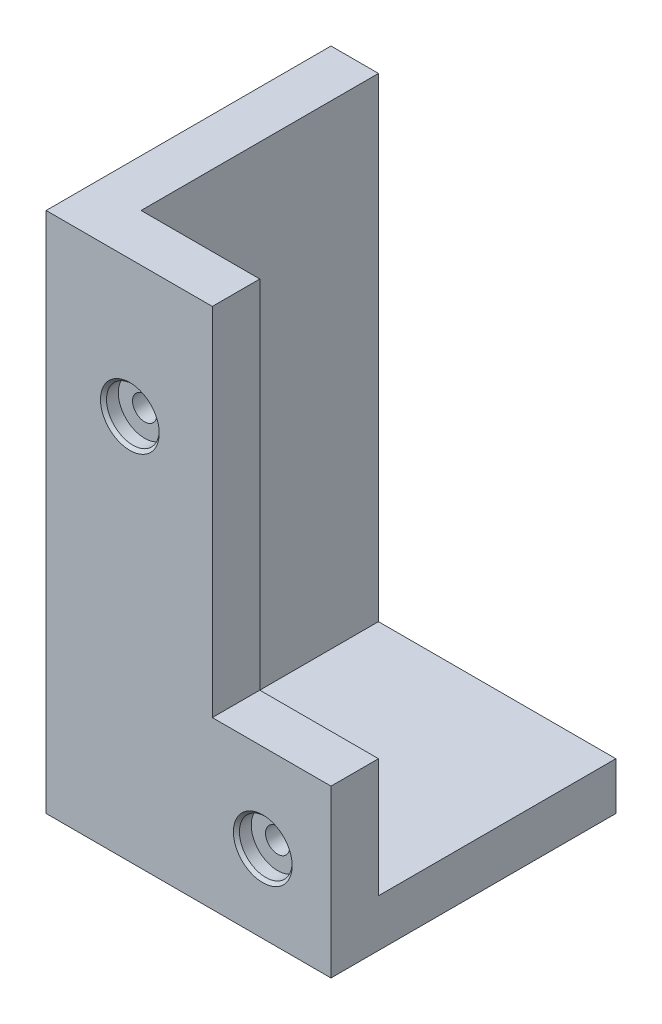
ISO-10303-21;
HEADER;
FILE_DESCRIPTION(('STEP AP214'),'2;1');
FILE_NAME('part.step','',(''),(''),'','','');
FILE_SCHEMA(('AUTOMOTIVE_DESIGN { 1 0 10303 214 1 1 1 1 }'));
ENDSEC;
DATA;
#1=APPLICATION_CONTEXT('core data for automotive mechanical design processes');
#2=APPLICATION_PROTOCOL_DEFINITION('international standard','automotive_design',2000,#1);
#3=PRODUCT_CONTEXT('',#1,'mechanical');
#4=PRODUCT('Part','Part','',(#3));
#5=PRODUCT_RELATED_PRODUCT_CATEGORY('part','',(#4));
#6=PRODUCT_DEFINITION_FORMATION('','',#4);
#7=PRODUCT_DEFINITION_CONTEXT('part definition',#1,'design');
#8=PRODUCT_DEFINITION('design','',#6,#7);
#9=PRODUCT_DEFINITION_SHAPE('','',#8);
#10=(LENGTH_UNIT() NAMED_UNIT(*) SI_UNIT(.MILLI.,.METRE.));
#11=(NAMED_UNIT(*) PLANE_ANGLE_UNIT() SI_UNIT($,.RADIAN.));
#12=(NAMED_UNIT(*) SI_UNIT($,.STERADIAN.) SOLID_ANGLE_UNIT());
#13=UNCERTAINTY_MEASURE_WITH_UNIT(LENGTH_MEASURE(1.E-05),#10,'distance_accuracy_value','');
#14=(GEOMETRIC_REPRESENTATION_CONTEXT(3) GLOBAL_UNCERTAINTY_ASSIGNED_CONTEXT((#13)) GLOBAL_UNIT_ASSIGNED_CONTEXT((#10,
#11,#12)) REPRESENTATION_CONTEXT('',''));
#15=CARTESIAN_POINT('',(0.,0.,0.));
#16=DIRECTION('',(0.,0.,1.));
#17=DIRECTION('',(1.,0.,0.));
#18=AXIS2_PLACEMENT_3D('',#15,#16,#17);
#19=CARTESIAN_POINT('',(0.,0.,50.));
#20=DIRECTION('',(1.,0.,0.));
#21=DIRECTION('',(0.,0.,-1.));
#22=AXIS2_PLACEMENT_3D('',#19,#20,#21);
#23=PLANE('',#22);
#24=DIRECTION('',(0.,-1.,0.));
#25=VECTOR('',#24,1.);
#26=CARTESIAN_POINT('',(0.,0.,0.));
#27=LINE('',#26,#25);
#28=CARTESIAN_POINT('',(0.,110.,0.));
#29=VERTEX_POINT('',#28);
#30=CARTESIAN_POINT('',(0.,0.,0.));
#31=VERTEX_POINT('',#30);
#32=EDGE_CURVE('E96',#29,#31,#27,.T.);
#33=ORIENTED_EDGE('',*,*,#32,.T.);
#34=DIRECTION('',(0.,0.,-1.));
#35=VECTOR('',#34,1.);
#36=CARTESIAN_POINT('',(0.,0.,50.));
#37=LINE('',#36,#35);
#38=CARTESIAN_POINT('',(0.,0.,60.));
#39=VERTEX_POINT('',#38);
#40=EDGE_CURVE('E11',#39,#31,#37,.T.);
#41=ORIENTED_EDGE('',*,*,#40,.F.);
#42=DIRECTION('',(0.,-1.,0.));
#43=VECTOR('',#42,1.);
#44=CARTESIAN_POINT('',(0.,0.,60.));
#45=LINE('',#44,#43);
#46=CARTESIAN_POINT('',(0.,110.,60.));
#47=VERTEX_POINT('',#46);
#48=EDGE_CURVE('E98',#47,#39,#45,.T.);
#49=ORIENTED_EDGE('',*,*,#48,.F.);
#50=DIRECTION('',(0.,0.,-1.));
#51=VECTOR('',#50,1.);
#52=CARTESIAN_POINT('',(0.,110.,50.));
#53=LINE('',#52,#51);
#54=EDGE_CURVE('E84',#47,#29,#53,.T.);
#55=ORIENTED_EDGE('',*,*,#54,.T.);
#56=EDGE_LOOP('',(#33,#41,#49,#55));
#57=FACE_BOUND('',#56,.T.);
#58=ADVANCED_FACE('F33',(#57),#23,.F.);
#59=CARTESIAN_POINT('',(0.,0.,50.));
#60=DIRECTION('',(0.,1.,0.));
#61=DIRECTION('',(0.,0.,1.));
#62=AXIS2_PLACEMENT_3D('',#59,#60,#61);
#63=PLANE('',#62);
#64=DIRECTION('',(1.,0.,0.));
#65=VECTOR('',#64,1.);
#66=CARTESIAN_POINT('',(0.,0.,0.));
#67=LINE('',#66,#65);
#68=CARTESIAN_POINT('',(60.,0.,0.));
#69=VERTEX_POINT('',#68);
#70=EDGE_CURVE('E103',#31,#69,#67,.T.);
#71=ORIENTED_EDGE('',*,*,#70,.T.);
#72=DIRECTION('',(0.,0.,-1.));
#73=VECTOR('',#72,1.);
#74=CARTESIAN_POINT('',(60.,0.,50.));
#75=LINE('',#74,#73);
#76=CARTESIAN_POINT('',(60.,0.,60.));
#77=VERTEX_POINT('',#76);
#78=EDGE_CURVE('E42',#77,#69,#75,.T.);
#79=ORIENTED_EDGE('',*,*,#78,.F.);
#80=DIRECTION('',(1.,0.,0.));
#81=VECTOR('',#80,1.);
#82=CARTESIAN_POINT('',(60.,0.,60.));
#83=LINE('',#82,#81);
#84=EDGE_CURVE('E154',#39,#77,#83,.T.);
#85=ORIENTED_EDGE('',*,*,#84,.F.);
#86=ORIENTED_EDGE('',*,*,#40,.T.);
#87=EDGE_LOOP('',(#71,#79,#85,#86));
#88=FACE_BOUND('',#87,.T.);
#89=ADVANCED_FACE('F224',(#88),#63,.F.);
#90=CARTESIAN_POINT('',(60.,10.,50.));
#91=DIRECTION('',(-1.,0.,0.));
#92=DIRECTION('',(0.,0.,1.));
#93=AXIS2_PLACEMENT_3D('',#90,#91,#92);
#94=PLANE('',#93);
#95=DIRECTION('',(0.,1.,0.));
#96=VECTOR('',#95,1.);
#97=CARTESIAN_POINT('',(60.,10.,0.));
#98=LINE('',#97,#96);
#99=CARTESIAN_POINT('',(60.,10.,0.));
#100=VERTEX_POINT('',#99);
#101=EDGE_CURVE('E106',#69,#100,#98,.T.);
#102=ORIENTED_EDGE('',*,*,#101,.T.);
#103=DIRECTION('',(0.,0.,-1.));
#104=VECTOR('',#103,1.);
#105=CARTESIAN_POINT('',(60.,10.,50.));
#106=LINE('',#105,#104);
#107=CARTESIAN_POINT('',(60.,10.,50.));
#108=VERTEX_POINT('',#107);
#109=EDGE_CURVE('E120',#108,#100,#106,.T.);
#110=ORIENTED_EDGE('',*,*,#109,.F.);
#111=DIRECTION('',(0.,1.,0.));
#112=VECTOR('',#111,1.);
#113=CARTESIAN_POINT('',(60.,35.,50.));
#114=LINE('',#113,#112);
#115=CARTESIAN_POINT('',(60.,35.,50.));
#116=VERTEX_POINT('',#115);
#117=EDGE_CURVE('E137',#108,#116,#114,.T.);
#118=ORIENTED_EDGE('',*,*,#117,.T.);
#119=DIRECTION('',(0.,0.,-1.));
#120=VECTOR('',#119,1.);
#121=CARTESIAN_POINT('',(60.,35.,60.));
#122=LINE('',#121,#120);
#123=CARTESIAN_POINT('',(60.,35.,60.));
#124=VERTEX_POINT('',#123);
#125=EDGE_CURVE('E104',#124,#116,#122,.T.);
#126=ORIENTED_EDGE('',*,*,#125,.F.);
#127=DIRECTION('',(0.,1.,0.));
#128=VECTOR('',#127,1.);
#129=CARTESIAN_POINT('',(60.,35.,60.));
#130=LINE('',#129,#128);
#131=EDGE_CURVE('E158',#77,#124,#130,.T.);
#132=ORIENTED_EDGE('',*,*,#131,.F.);
#133=ORIENTED_EDGE('',*,*,#78,.T.);
#134=EDGE_LOOP('',(#102,#110,#118,#126,#132,#133));
#135=FACE_BOUND('',#134,.T.);
#136=ADVANCED_FACE('F207',(#135),#94,.F.);
#137=CARTESIAN_POINT('',(10.,10.,50.));
#138=DIRECTION('',(0.,-1.,0.));
#139=DIRECTION('',(0.,0.,-1.));
#140=AXIS2_PLACEMENT_3D('',#137,#138,#139);
#141=PLANE('',#140);
#142=DIRECTION('',(-1.,0.,0.));
#143=VECTOR('',#142,1.);
#144=CARTESIAN_POINT('',(10.,10.,0.));
#145=LINE('',#144,#143);
#146=CARTESIAN_POINT('',(10.,10.,0.));
#147=VERTEX_POINT('',#146);
#148=EDGE_CURVE('E116',#100,#147,#145,.T.);
#149=ORIENTED_EDGE('',*,*,#148,.T.);
#150=DIRECTION('',(0.,0.,-1.));
#151=VECTOR('',#150,1.);
#152=CARTESIAN_POINT('',(10.,10.,50.));
#153=LINE('',#152,#151);
#154=CARTESIAN_POINT('',(10.,10.,50.));
#155=VERTEX_POINT('',#154);
#156=EDGE_CURVE('E51',#155,#147,#153,.T.);
#157=ORIENTED_EDGE('',*,*,#156,.F.);
#158=DIRECTION('',(-1.,0.,0.));
#159=VECTOR('',#158,1.);
#160=CARTESIAN_POINT('',(10.,10.,50.));
#161=LINE('',#160,#159);
#162=EDGE_CURVE('E90',#108,#155,#161,.T.);
#163=ORIENTED_EDGE('',*,*,#162,.F.);
#164=ORIENTED_EDGE('',*,*,#109,.T.);
#165=EDGE_LOOP('',(#149,#157,#163,#164));
#166=FACE_BOUND('',#165,.T.);
#167=ADVANCED_FACE('F226',(#166),#141,.F.);
#168=CARTESIAN_POINT('',(10.,110.,50.));
#169=DIRECTION('',(-1.,0.,0.));
#170=DIRECTION('',(0.,0.,1.));
#171=AXIS2_PLACEMENT_3D('',#168,#169,#170);
#172=PLANE('',#171);
#173=DIRECTION('',(0.,1.,0.));
#174=VECTOR('',#173,1.);
#175=CARTESIAN_POINT('',(10.,110.,0.));
#176=LINE('',#175,#174);
#177=CARTESIAN_POINT('',(10.,110.,0.));
#178=VERTEX_POINT('',#177);
#179=EDGE_CURVE('E73',#147,#178,#176,.T.);
#180=ORIENTED_EDGE('',*,*,#179,.T.);
#181=DIRECTION('',(0.,0.,-1.));
#182=VECTOR('',#181,1.);
#183=CARTESIAN_POINT('',(10.,110.,50.));
#184=LINE('',#183,#182);
#185=CARTESIAN_POINT('',(10.,110.,50.));
#186=VERTEX_POINT('',#185);
#187=EDGE_CURVE('E87',#186,#178,#184,.T.);
#188=ORIENTED_EDGE('',*,*,#187,.F.);
#189=DIRECTION('',(0.,1.,0.));
#190=VECTOR('',#189,1.);
#191=CARTESIAN_POINT('',(10.,110.,50.));
#192=LINE('',#191,#190);
#193=EDGE_CURVE('E99',#155,#186,#192,.T.);
#194=ORIENTED_EDGE('',*,*,#193,.F.);
#195=ORIENTED_EDGE('',*,*,#156,.T.);
#196=EDGE_LOOP('',(#180,#188,#194,#195));
#197=FACE_BOUND('',#196,.T.);
#198=ADVANCED_FACE('F220',(#197),#172,.F.);
#199=CARTESIAN_POINT('',(0.,110.,50.));
#200=DIRECTION('',(0.,-1.,0.));
#201=DIRECTION('',(1.,0.,0.));
#202=AXIS2_PLACEMENT_3D('',#199,#200,#201);
#203=PLANE('',#202);
#204=DIRECTION('',(-1.,0.,0.));
#205=VECTOR('',#204,1.);
#206=CARTESIAN_POINT('',(0.,110.,0.));
#207=LINE('',#206,#205);
#208=EDGE_CURVE('E79',#178,#29,#207,.T.);
#209=ORIENTED_EDGE('',*,*,#208,.T.);
#210=ORIENTED_EDGE('',*,*,#54,.F.);
#211=DIRECTION('',(-1.,0.,0.));
#212=VECTOR('',#211,1.);
#213=CARTESIAN_POINT('',(0.,110.,60.));
#214=LINE('',#213,#212);
#215=CARTESIAN_POINT('',(35.,110.,60.));
#216=VERTEX_POINT('',#215);
#217=EDGE_CURVE('E167',#216,#47,#214,.T.);
#218=ORIENTED_EDGE('',*,*,#217,.F.);
#219=DIRECTION('',(0.,0.,-1.));
#220=VECTOR('',#219,1.);
#221=CARTESIAN_POINT('',(35.,110.,60.));
#222=LINE('',#221,#220);
#223=CARTESIAN_POINT('',(35.,110.,50.));
#224=VERTEX_POINT('',#223);
#225=EDGE_CURVE('E169',#216,#224,#222,.T.);
#226=ORIENTED_EDGE('',*,*,#225,.T.);
#227=DIRECTION('',(-1.,0.,0.));
#228=VECTOR('',#227,1.);
#229=CARTESIAN_POINT('',(0.,110.,50.));
#230=LINE('',#229,#228);
#231=EDGE_CURVE('E155',#224,#186,#230,.T.);
#232=ORIENTED_EDGE('',*,*,#231,.T.);
#233=ORIENTED_EDGE('',*,*,#187,.T.);
#234=EDGE_LOOP('',(#209,#210,#218,#226,#232,#233));
#235=FACE_BOUND('',#234,.T.);
#236=ADVANCED_FACE('F81',(#235),#203,.F.);
#237=CARTESIAN_POINT('',(0.,0.,0.));
#238=DIRECTION('',(0.,0.,-1.));
#239=DIRECTION('',(-1.,0.,0.));
#240=AXIS2_PLACEMENT_3D('',#237,#238,#239);
#241=PLANE('',#240);
#242=ORIENTED_EDGE('',*,*,#32,.F.);
#243=ORIENTED_EDGE('',*,*,#208,.F.);
#244=ORIENTED_EDGE('',*,*,#179,.F.);
#245=ORIENTED_EDGE('',*,*,#148,.F.);
#246=ORIENTED_EDGE('',*,*,#101,.F.);
#247=ORIENTED_EDGE('',*,*,#70,.F.);
#248=EDGE_LOOP('',(#242,#243,#244,#245,#246,#247));
#249=FACE_BOUND('',#248,.T.);
#250=ADVANCED_FACE('F101',(#249),#241,.T.);
#251=CARTESIAN_POINT('',(35.,35.,60.));
#252=DIRECTION('',(0.,-1.,0.));
#253=DIRECTION('',(0.,0.,-1.));
#254=AXIS2_PLACEMENT_3D('',#251,#252,#253);
#255=PLANE('',#254);
#256=DIRECTION('',(-1.,0.,0.));
#257=VECTOR('',#256,1.);
#258=CARTESIAN_POINT('',(35.,35.,50.));
#259=LINE('',#258,#257);
#260=CARTESIAN_POINT('',(35.,35.,50.));
#261=VERTEX_POINT('',#260);
#262=EDGE_CURVE('E142',#116,#261,#259,.T.);
#263=ORIENTED_EDGE('',*,*,#262,.T.);
#264=DIRECTION('',(0.,0.,-1.));
#265=VECTOR('',#264,1.);
#266=CARTESIAN_POINT('',(35.,35.,60.));
#267=LINE('',#266,#265);
#268=CARTESIAN_POINT('',(35.,35.,60.));
#269=VERTEX_POINT('',#268);
#270=EDGE_CURVE('E109',#269,#261,#267,.T.);
#271=ORIENTED_EDGE('',*,*,#270,.F.);
#272=DIRECTION('',(-1.,0.,0.));
#273=VECTOR('',#272,1.);
#274=CARTESIAN_POINT('',(35.,35.,60.));
#275=LINE('',#274,#273);
#276=EDGE_CURVE('E161',#124,#269,#275,.T.);
#277=ORIENTED_EDGE('',*,*,#276,.F.);
#278=ORIENTED_EDGE('',*,*,#125,.T.);
#279=EDGE_LOOP('',(#263,#271,#277,#278));
#280=FACE_BOUND('',#279,.T.);
#281=ADVANCED_FACE('F201',(#280),#255,.F.);
#282=CARTESIAN_POINT('',(35.,110.,60.));
#283=DIRECTION('',(-1.,0.,0.));
#284=DIRECTION('',(0.,-1.,0.));
#285=AXIS2_PLACEMENT_3D('',#282,#283,#284);
#286=PLANE('',#285);
#287=DIRECTION('',(0.,1.,0.));
#288=VECTOR('',#287,1.);
#289=CARTESIAN_POINT('',(35.,110.,50.));
#290=LINE('',#289,#288);
#291=EDGE_CURVE('E175',#261,#224,#290,.T.);
#292=ORIENTED_EDGE('',*,*,#291,.T.);
#293=ORIENTED_EDGE('',*,*,#225,.F.);
#294=DIRECTION('',(0.,1.,0.));
#295=VECTOR('',#294,1.);
#296=CARTESIAN_POINT('',(35.,110.,60.));
#297=LINE('',#296,#295);
#298=EDGE_CURVE('E164',#269,#216,#297,.T.);
#299=ORIENTED_EDGE('',*,*,#298,.F.);
#300=ORIENTED_EDGE('',*,*,#270,.T.);
#301=EDGE_LOOP('',(#292,#293,#299,#300));
#302=FACE_BOUND('',#301,.T.);
#303=ADVANCED_FACE('F187',(#302),#286,.F.);
#304=CARTESIAN_POINT('',(0.,0.,60.));
#305=DIRECTION('',(0.,0.,-1.));
#306=DIRECTION('',(-1.,0.,0.));
#307=AXIS2_PLACEMENT_3D('',#304,#305,#306);
#308=PLANE('',#307);
#309=CARTESIAN_POINT('',(17.6351665653214,81.2461867717238,60.));
#310=DIRECTION('',(0.,0.,1.));
#311=DIRECTION('',(1.,0.,0.));
#312=AXIS2_PLACEMENT_3D('',#309,#310,#311);
#313=CIRCLE('',#312,6.19125);
#314=CARTESIAN_POINT('',(23.8264165653214,81.2461867717238,60.));
#315=VERTEX_POINT('',#314);
#316=EDGE_CURVE('E412',#315,#315,#313,.T.);
#317=ORIENTED_EDGE('',*,*,#316,.F.);
#318=EDGE_LOOP('',(#317));
#319=FACE_BOUND('',#318,.T.);
#320=CARTESIAN_POINT('',(45.6310724551598,16.389004793598,60.));
#321=DIRECTION('',(0.,0.,1.));
#322=DIRECTION('',(1.,0.,0.));
#323=AXIS2_PLACEMENT_3D('',#320,#321,#322);
#324=CIRCLE('',#323,6.19125);
#325=CARTESIAN_POINT('',(51.8223224551598,16.389004793598,60.));
#326=VERTEX_POINT('',#325);
#327=EDGE_CURVE('E422',#326,#326,#324,.T.);
#328=ORIENTED_EDGE('',*,*,#327,.F.);
#329=EDGE_LOOP('',(#328));
#330=FACE_BOUND('',#329,.T.);
#331=ORIENTED_EDGE('',*,*,#48,.T.);
#332=ORIENTED_EDGE('',*,*,#84,.T.);
#333=ORIENTED_EDGE('',*,*,#131,.T.);
#334=ORIENTED_EDGE('',*,*,#276,.T.);
#335=ORIENTED_EDGE('',*,*,#298,.T.);
#336=ORIENTED_EDGE('',*,*,#217,.T.);
#337=EDGE_LOOP('',(#331,#332,#333,#334,#335,#336));
#338=FACE_BOUND('',#337,.T.);
#339=ADVANCED_FACE('F221',(#319,#330,#338),#308,.F.);
#340=CARTESIAN_POINT('',(0.,0.,50.));
#341=DIRECTION('',(0.,0.,-1.));
#342=DIRECTION('',(-1.,0.,0.));
#343=AXIS2_PLACEMENT_3D('',#340,#341,#342);
#344=PLANE('',#343);
#345=CARTESIAN_POINT('',(17.6351665653214,81.2461867717238,50.));
#346=DIRECTION('',(0.,0.,-1.));
#347=DIRECTION('',(-1.,0.,0.));
#348=AXIS2_PLACEMENT_3D('',#345,#346,#347);
#349=CIRCLE('',#348,2.55269999999999);
#350=CARTESIAN_POINT('',(15.0824665653214,81.2461867717238,50.));
#351=VERTEX_POINT('',#350);
#352=EDGE_CURVE('E36',#351,#351,#349,.T.);
#353=ORIENTED_EDGE('',*,*,#352,.F.);
#354=EDGE_LOOP('',(#353));
#355=FACE_BOUND('',#354,.T.);
#356=CARTESIAN_POINT('',(45.6310724551598,16.389004793598,50.));
#357=DIRECTION('',(0.,0.,-1.));
#358=DIRECTION('',(-1.,0.,0.));
#359=AXIS2_PLACEMENT_3D('',#356,#357,#358);
#360=CIRCLE('',#359,2.55269999999999);
#361=CARTESIAN_POINT('',(43.0783724551598,16.389004793598,50.));
#362=VERTEX_POINT('',#361);
#363=EDGE_CURVE('E135',#362,#362,#360,.T.);
#364=ORIENTED_EDGE('',*,*,#363,.F.);
#365=EDGE_LOOP('',(#364));
#366=FACE_BOUND('',#365,.T.);
#367=ORIENTED_EDGE('',*,*,#117,.F.);
#368=ORIENTED_EDGE('',*,*,#162,.T.);
#369=ORIENTED_EDGE('',*,*,#193,.T.);
#370=ORIENTED_EDGE('',*,*,#231,.F.);
#371=ORIENTED_EDGE('',*,*,#291,.F.);
#372=ORIENTED_EDGE('',*,*,#262,.F.);
#373=EDGE_LOOP('',(#367,#368,#369,#370,#371,#372));
#374=FACE_BOUND('',#373,.T.);
#375=ADVANCED_FACE('F200',(#355,#366,#374),#344,.T.);
#376=CARTESIAN_POINT('',(45.6310724551598,16.389004793598,60.));
#377=DIRECTION('',(0.,0.,1.));
#378=DIRECTION('',(1.,0.,0.));
#379=AXIS2_PLACEMENT_3D('',#376,#377,#378);
#380=CYLINDRICAL_SURFACE('',#379,2.55269999999999);
#381=ORIENTED_EDGE('',*,*,#363,.T.);
#382=EDGE_LOOP('',(#381));
#383=FACE_BOUND('',#382,.T.);
#384=CARTESIAN_POINT('',(45.6310724551598,16.389004793598,56.8758));
#385=DIRECTION('',(0.,0.,1.));
#386=DIRECTION('',(1.,0.,0.));
#387=AXIS2_PLACEMENT_3D('',#384,#385,#386);
#388=CIRCLE('',#387,2.5527);
#389=CARTESIAN_POINT('',(48.1837724551598,16.389004793598,56.8758));
#390=VERTEX_POINT('',#389);
#391=EDGE_CURVE('E138',#390,#390,#388,.T.);
#392=ORIENTED_EDGE('',*,*,#391,.T.);
#393=EDGE_LOOP('',(#392));
#394=FACE_BOUND('',#393,.T.);
#395=ADVANCED_FACE('F280',(#383,#394),#380,.F.);
#396=CARTESIAN_POINT('',(51.1873224551598,16.389004793598,56.8758));
#397=DIRECTION('',(0.,0.,-1.));
#398=DIRECTION('',(-1.,0.,0.));
#399=AXIS2_PLACEMENT_3D('',#396,#397,#398);
#400=PLANE('',#399);
#401=ORIENTED_EDGE('',*,*,#391,.F.);
#402=EDGE_LOOP('',(#401));
#403=FACE_BOUND('',#402,.T.);
#404=CARTESIAN_POINT('',(45.6310724551598,16.389004793598,56.8758));
#405=DIRECTION('',(0.,0.,1.));
#406=DIRECTION('',(1.,0.,0.));
#407=AXIS2_PLACEMENT_3D('',#404,#405,#406);
#408=CIRCLE('',#407,5.55625);
#409=CARTESIAN_POINT('',(51.1873224551598,16.389004793598,56.8758));
#410=VERTEX_POINT('',#409);
#411=EDGE_CURVE('E144',#410,#410,#408,.T.);
#412=ORIENTED_EDGE('',*,*,#411,.T.);
#413=EDGE_LOOP('',(#412));
#414=FACE_BOUND('',#413,.T.);
#415=ADVANCED_FACE('F290',(#403,#414),#400,.F.);
#416=CARTESIAN_POINT('',(45.6310724551598,16.389004793598,60.));
#417=DIRECTION('',(0.,0.,1.));
#418=DIRECTION('',(1.,0.,0.));
#419=AXIS2_PLACEMENT_3D('',#416,#417,#418);
#420=CYLINDRICAL_SURFACE('',#419,5.55625);
#421=ORIENTED_EDGE('',*,*,#411,.F.);
#422=EDGE_LOOP('',(#421));
#423=FACE_BOUND('',#422,.T.);
#424=CARTESIAN_POINT('',(45.6310724551598,16.389004793598,59.365));
#425=DIRECTION('',(0.,0.,1.));
#426=DIRECTION('',(1.,0.,0.));
#427=AXIS2_PLACEMENT_3D('',#424,#425,#426);
#428=CIRCLE('',#427,5.55625);
#429=CARTESIAN_POINT('',(51.1873224551598,16.389004793598,59.365));
#430=VERTEX_POINT('',#429);
#431=EDGE_CURVE('E149',#430,#430,#428,.T.);
#432=ORIENTED_EDGE('',*,*,#431,.T.);
#433=EDGE_LOOP('',(#432));
#434=FACE_BOUND('',#433,.T.);
#435=ADVANCED_FACE('F296',(#423,#434),#420,.F.);
#436=CARTESIAN_POINT('',(45.6310724551598,16.389004793598,60.));
#437=DIRECTION('',(0.,0.,1.));
#438=DIRECTION('',(1.,0.,0.));
#439=AXIS2_PLACEMENT_3D('',#436,#437,#438);
#440=CONICAL_SURFACE('',#439,6.19125,0.785398163397448);
#441=ORIENTED_EDGE('',*,*,#431,.F.);
#442=EDGE_LOOP('',(#441));
#443=FACE_BOUND('',#442,.T.);
#444=ORIENTED_EDGE('',*,*,#327,.T.);
#445=EDGE_LOOP('',(#444));
#446=FACE_BOUND('',#445,.T.);
#447=ADVANCED_FACE('F304',(#443,#446),#440,.F.);
#448=CARTESIAN_POINT('',(17.6351665653214,81.2461867717238,60.));
#449=DIRECTION('',(0.,0.,1.));
#450=DIRECTION('',(1.,0.,0.));
#451=AXIS2_PLACEMENT_3D('',#448,#449,#450);
#452=CYLINDRICAL_SURFACE('',#451,2.55269999999999);
#453=ORIENTED_EDGE('',*,*,#352,.T.);
#454=EDGE_LOOP('',(#453));
#455=FACE_BOUND('',#454,.T.);
#456=CARTESIAN_POINT('',(17.6351665653214,81.2461867717238,56.8758));
#457=DIRECTION('',(0.,0.,1.));
#458=DIRECTION('',(1.,0.,0.));
#459=AXIS2_PLACEMENT_3D('',#456,#457,#458);
#460=CIRCLE('',#459,2.5527);
#461=CARTESIAN_POINT('',(20.1878665653214,81.2461867717238,56.8758));
#462=VERTEX_POINT('',#461);
#463=EDGE_CURVE('E419',#462,#462,#460,.T.);
#464=ORIENTED_EDGE('',*,*,#463,.T.);
#465=EDGE_LOOP('',(#464));
#466=FACE_BOUND('',#465,.T.);
#467=ADVANCED_FACE('F312',(#455,#466),#452,.F.);
#468=CARTESIAN_POINT('',(23.1914165653213,81.2461867717238,56.8758));
#469=DIRECTION('',(0.,0.,-1.));
#470=DIRECTION('',(-1.,0.,0.));
#471=AXIS2_PLACEMENT_3D('',#468,#469,#470);
#472=PLANE('',#471);
#473=ORIENTED_EDGE('',*,*,#463,.F.);
#474=EDGE_LOOP('',(#473));
#475=FACE_BOUND('',#474,.T.);
#476=CARTESIAN_POINT('',(17.6351665653214,81.2461867717238,56.8758));
#477=DIRECTION('',(0.,0.,1.));
#478=DIRECTION('',(1.,0.,0.));
#479=AXIS2_PLACEMENT_3D('',#476,#477,#478);
#480=CIRCLE('',#479,5.55625);
#481=CARTESIAN_POINT('',(23.1914165653213,81.2461867717238,56.8758));
#482=VERTEX_POINT('',#481);
#483=EDGE_CURVE('E414',#482,#482,#480,.T.);
#484=ORIENTED_EDGE('',*,*,#483,.T.);
#485=EDGE_LOOP('',(#484));
#486=FACE_BOUND('',#485,.T.);
#487=ADVANCED_FACE('F320',(#475,#486),#472,.F.);
#488=CARTESIAN_POINT('',(17.6351665653214,81.2461867717238,60.));
#489=DIRECTION('',(0.,0.,1.));
#490=DIRECTION('',(1.,0.,0.));
#491=AXIS2_PLACEMENT_3D('',#488,#489,#490);
#492=CYLINDRICAL_SURFACE('',#491,5.55625);
#493=ORIENTED_EDGE('',*,*,#483,.F.);
#494=EDGE_LOOP('',(#493));
#495=FACE_BOUND('',#494,.T.);
#496=CARTESIAN_POINT('',(17.6351665653214,81.2461867717238,59.365));
#497=DIRECTION('',(0.,0.,1.));
#498=DIRECTION('',(1.,0.,0.));
#499=AXIS2_PLACEMENT_3D('',#496,#497,#498);
#500=CIRCLE('',#499,5.55625);
#501=CARTESIAN_POINT('',(23.1914165653214,81.2461867717238,59.365));
#502=VERTEX_POINT('',#501);
#503=EDGE_CURVE('E409',#502,#502,#500,.T.);
#504=ORIENTED_EDGE('',*,*,#503,.T.);
#505=EDGE_LOOP('',(#504));
#506=FACE_BOUND('',#505,.T.);
#507=ADVANCED_FACE('F328',(#495,#506),#492,.F.);
#508=CARTESIAN_POINT('',(17.6351665653214,81.2461867717238,60.));
#509=DIRECTION('',(0.,0.,1.));
#510=DIRECTION('',(1.,0.,0.));
#511=AXIS2_PLACEMENT_3D('',#508,#509,#510);
#512=CONICAL_SURFACE('',#511,6.19125,0.785398163397448);
#513=ORIENTED_EDGE('',*,*,#503,.F.);
#514=EDGE_LOOP('',(#513));
#515=FACE_BOUND('',#514,.T.);
#516=ORIENTED_EDGE('',*,*,#316,.T.);
#517=EDGE_LOOP('',(#516));
#518=FACE_BOUND('',#517,.T.);
#519=ADVANCED_FACE('F336',(#515,#518),#512,.F.);
#520=CLOSED_SHELL('',(#58,#89,#136,#167,#198,#236,#250,#281,#303,#339,#375,#395,#415,#435,#447,
#467,#487,#507,#519));
#521=MANIFOLD_SOLID_BREP('B2',#520);
#522=ADVANCED_BREP_SHAPE_REPRESENTATION('',(#18,#521),#14);
#523=SHAPE_DEFINITION_REPRESENTATION(#9,#522);
ENDSEC;
END-ISO-10303-21;
